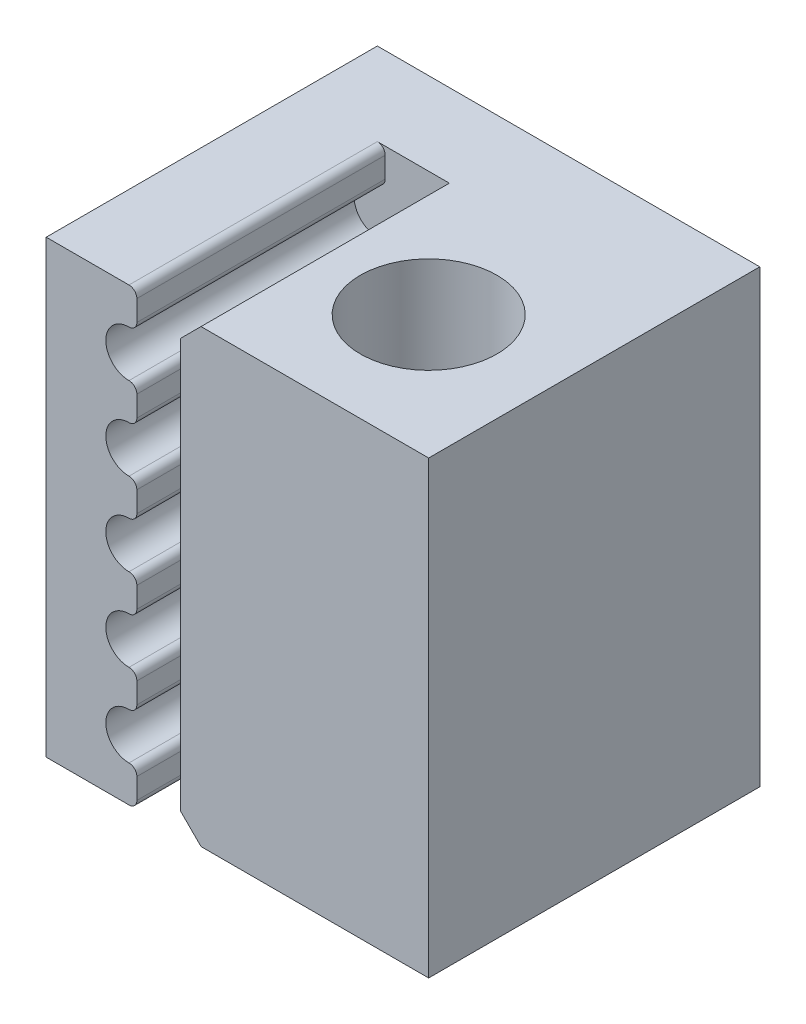
ISO-10303-21;
HEADER;
FILE_DESCRIPTION(('STEP AP214'),'2;1');
FILE_NAME('part.step','',(''),(''),'','','');
FILE_SCHEMA(('AUTOMOTIVE_DESIGN { 1 0 10303 214 1 1 1 1 }'));
ENDSEC;
DATA;
#1=APPLICATION_CONTEXT('core data for automotive mechanical design processes');
#2=APPLICATION_PROTOCOL_DEFINITION('international standard','automotive_design',2000,#1);
#3=PRODUCT_CONTEXT('',#1,'mechanical');
#4=PRODUCT('Part','Part','',(#3));
#5=PRODUCT_RELATED_PRODUCT_CATEGORY('part','',(#4));
#6=PRODUCT_DEFINITION_FORMATION('','',#4);
#7=PRODUCT_DEFINITION_CONTEXT('part definition',#1,'design');
#8=PRODUCT_DEFINITION('design','',#6,#7);
#9=PRODUCT_DEFINITION_SHAPE('','',#8);
#10=(LENGTH_UNIT() NAMED_UNIT(*) SI_UNIT(.MILLI.,.METRE.));
#11=(NAMED_UNIT(*) PLANE_ANGLE_UNIT() SI_UNIT($,.RADIAN.));
#12=(NAMED_UNIT(*) SI_UNIT($,.STERADIAN.) SOLID_ANGLE_UNIT());
#13=UNCERTAINTY_MEASURE_WITH_UNIT(LENGTH_MEASURE(1.E-05),#10,'distance_accuracy_value','');
#14=(GEOMETRIC_REPRESENTATION_CONTEXT(3) GLOBAL_UNCERTAINTY_ASSIGNED_CONTEXT((#13)) GLOBAL_UNIT_ASSIGNED_CONTEXT((#10,
#11,#12)) REPRESENTATION_CONTEXT('',''));
#15=CARTESIAN_POINT('',(0.,0.,0.));
#16=DIRECTION('',(0.,0.,1.));
#17=DIRECTION('',(1.,0.,0.));
#18=AXIS2_PLACEMENT_3D('',#15,#16,#17);
#19=CARTESIAN_POINT('',(0.,0.,0.));
#20=DIRECTION('',(0.,0.,-1.));
#21=DIRECTION('',(-1.,0.,0.));
#22=AXIS2_PLACEMENT_3D('',#19,#20,#21);
#23=PLANE('',#22);
#24=DIRECTION('',(0.,-1.,0.));
#25=VECTOR('',#24,1.);
#26=CARTESIAN_POINT('',(-6.,-5.80412192862059,0.));
#27=LINE('',#26,#25);
#28=CARTESIAN_POINT('',(-6.,10.38,0.));
#29=VERTEX_POINT('',#28);
#30=CARTESIAN_POINT('',(-6.,0.500000000000006,0.));
#31=VERTEX_POINT('',#30);
#32=EDGE_CURVE('E272',#29,#31,#27,.T.);
#33=ORIENTED_EDGE('',*,*,#32,.F.);
#34=DIRECTION('',(-0.707106781186549,-0.707106781186546,0.));
#35=VECTOR('',#34,1.);
#36=CARTESIAN_POINT('',(-8.18999999999999,8.19000000000002,0.));
#37=LINE('',#36,#35);
#38=CARTESIAN_POINT('',(-5.5,10.88,0.));
#39=VERTEX_POINT('',#38);
#40=EDGE_CURVE('E11',#29,#39,#37,.F.);
#41=ORIENTED_EDGE('',*,*,#40,.T.);
#42=DIRECTION('',(1.,0.,0.));
#43=VECTOR('',#42,1.);
#44=CARTESIAN_POINT('',(0.,10.88,0.));
#45=LINE('',#44,#43);
#46=CARTESIAN_POINT('',(-7.24,10.88,0.));
#47=VERTEX_POINT('',#46);
#48=EDGE_CURVE('E47',#47,#39,#45,.T.);
#49=ORIENTED_EDGE('',*,*,#48,.F.);
#50=CARTESIAN_POINT('',(-7.24,10.69,0.));
#51=DIRECTION('',(0.,0.,1.));
#52=DIRECTION('',(1.,0.,0.));
#53=AXIS2_PLACEMENT_3D('',#50,#51,#52);
#54=CIRCLE('',#53,0.190000000000002);
#55=CARTESIAN_POINT('',(-7.05,10.69,0.));
#56=VERTEX_POINT('',#55);
#57=EDGE_CURVE('E291',#47,#56,#54,.F.);
#58=ORIENTED_EDGE('',*,*,#57,.T.);
#59=DIRECTION('',(0.,1.,0.));
#60=VECTOR('',#59,1.);
#61=CARTESIAN_POINT('',(-7.05,-5.80412192862059,0.));
#62=LINE('',#61,#60);
#63=CARTESIAN_POINT('',(-7.05,10.19,0.));
#64=VERTEX_POINT('',#63);
#65=EDGE_CURVE('E473',#64,#56,#62,.T.);
#66=ORIENTED_EDGE('',*,*,#65,.F.);
#67=CARTESIAN_POINT('',(-7.24,10.19,0.));
#68=DIRECTION('',(0.,0.,1.));
#69=DIRECTION('',(1.,0.,0.));
#70=AXIS2_PLACEMENT_3D('',#67,#68,#69);
#71=CIRCLE('',#70,0.190000000000001);
#72=CARTESIAN_POINT('',(-7.24,10.,0.));
#73=VERTEX_POINT('',#72);
#74=EDGE_CURVE('E471',#64,#73,#71,.F.);
#75=ORIENTED_EDGE('',*,*,#74,.T.);
#76=CARTESIAN_POINT('',(-7.24,9.44,0.));
#77=DIRECTION('',(0.,0.,1.));
#78=DIRECTION('',(1.,0.,0.));
#79=AXIS2_PLACEMENT_3D('',#76,#77,#78);
#80=CIRCLE('',#79,0.56);
#81=CARTESIAN_POINT('',(-7.24,8.88,0.));
#82=VERTEX_POINT('',#81);
#83=EDGE_CURVE('E469',#73,#82,#80,.T.);
#84=ORIENTED_EDGE('',*,*,#83,.T.);
#85=CARTESIAN_POINT('',(-7.24,8.69,0.));
#86=DIRECTION('',(0.,0.,1.));
#87=DIRECTION('',(1.,0.,0.));
#88=AXIS2_PLACEMENT_3D('',#85,#86,#87);
#89=CIRCLE('',#88,0.190000000000001);
#90=CARTESIAN_POINT('',(-7.05,8.69,0.));
#91=VERTEX_POINT('',#90);
#92=EDGE_CURVE('E466',#91,#82,#89,.T.);
#93=ORIENTED_EDGE('',*,*,#92,.F.);
#94=DIRECTION('',(0.,-1.,0.));
#95=VECTOR('',#94,1.);
#96=CARTESIAN_POINT('',(-7.05,-5.80412192862059,0.));
#97=LINE('',#96,#95);
#98=CARTESIAN_POINT('',(-7.05,8.19,0.));
#99=VERTEX_POINT('',#98);
#100=EDGE_CURVE('E464',#91,#99,#97,.T.);
#101=ORIENTED_EDGE('',*,*,#100,.T.);
#102=CARTESIAN_POINT('',(-7.24,8.19,0.));
#103=DIRECTION('',(0.,0.,1.));
#104=DIRECTION('',(1.,0.,0.));
#105=AXIS2_PLACEMENT_3D('',#102,#103,#104);
#106=CIRCLE('',#105,0.189999999999999);
#107=CARTESIAN_POINT('',(-7.24,8.,0.));
#108=VERTEX_POINT('',#107);
#109=EDGE_CURVE('E461',#108,#99,#106,.T.);
#110=ORIENTED_EDGE('',*,*,#109,.F.);
#111=CARTESIAN_POINT('',(-7.24,7.44,0.));
#112=DIRECTION('',(0.,0.,1.));
#113=DIRECTION('',(1.,0.,0.));
#114=AXIS2_PLACEMENT_3D('',#111,#112,#113);
#115=CIRCLE('',#114,0.56);
#116=CARTESIAN_POINT('',(-7.24,6.88,0.));
#117=VERTEX_POINT('',#116);
#118=EDGE_CURVE('E459',#108,#117,#115,.T.);
#119=ORIENTED_EDGE('',*,*,#118,.T.);
#120=CARTESIAN_POINT('',(-7.24,6.69,0.));
#121=DIRECTION('',(0.,0.,1.));
#122=DIRECTION('',(1.,0.,0.));
#123=AXIS2_PLACEMENT_3D('',#120,#121,#122);
#124=CIRCLE('',#123,0.190000000000001);
#125=CARTESIAN_POINT('',(-7.05,6.69,0.));
#126=VERTEX_POINT('',#125);
#127=EDGE_CURVE('E456',#126,#117,#124,.T.);
#128=ORIENTED_EDGE('',*,*,#127,.F.);
#129=DIRECTION('',(0.,-1.,0.));
#130=VECTOR('',#129,1.);
#131=CARTESIAN_POINT('',(-7.05,-5.80412192862059,0.));
#132=LINE('',#131,#130);
#133=CARTESIAN_POINT('',(-7.05,6.19,0.));
#134=VERTEX_POINT('',#133);
#135=EDGE_CURVE('E454',#126,#134,#132,.T.);
#136=ORIENTED_EDGE('',*,*,#135,.T.);
#137=CARTESIAN_POINT('',(-7.24,6.19,0.));
#138=DIRECTION('',(0.,0.,1.));
#139=DIRECTION('',(1.,0.,0.));
#140=AXIS2_PLACEMENT_3D('',#137,#138,#139);
#141=CIRCLE('',#140,0.189999999999999);
#142=CARTESIAN_POINT('',(-7.24,6.,0.));
#143=VERTEX_POINT('',#142);
#144=EDGE_CURVE('E451',#143,#134,#141,.T.);
#145=ORIENTED_EDGE('',*,*,#144,.F.);
#146=CARTESIAN_POINT('',(-7.24,5.44,0.));
#147=DIRECTION('',(0.,0.,1.));
#148=DIRECTION('',(1.,0.,0.));
#149=AXIS2_PLACEMENT_3D('',#146,#147,#148);
#150=CIRCLE('',#149,0.559999999999998);
#151=CARTESIAN_POINT('',(-7.24,4.88000000000001,0.));
#152=VERTEX_POINT('',#151);
#153=EDGE_CURVE('E449',#143,#152,#150,.T.);
#154=ORIENTED_EDGE('',*,*,#153,.T.);
#155=CARTESIAN_POINT('',(-7.24,4.69,0.));
#156=DIRECTION('',(0.,0.,1.));
#157=DIRECTION('',(1.,0.,0.));
#158=AXIS2_PLACEMENT_3D('',#155,#156,#157);
#159=CIRCLE('',#158,0.190000000000001);
#160=CARTESIAN_POINT('',(-7.05,4.69,0.));
#161=VERTEX_POINT('',#160);
#162=EDGE_CURVE('E446',#161,#152,#159,.T.);
#163=ORIENTED_EDGE('',*,*,#162,.F.);
#164=DIRECTION('',(0.,-1.,0.));
#165=VECTOR('',#164,1.);
#166=CARTESIAN_POINT('',(-7.05,-5.80412192862059,0.));
#167=LINE('',#166,#165);
#168=CARTESIAN_POINT('',(-7.05,4.19,0.));
#169=VERTEX_POINT('',#168);
#170=EDGE_CURVE('E444',#161,#169,#167,.T.);
#171=ORIENTED_EDGE('',*,*,#170,.T.);
#172=CARTESIAN_POINT('',(-7.24,4.19,0.));
#173=DIRECTION('',(0.,0.,1.));
#174=DIRECTION('',(1.,0.,0.));
#175=AXIS2_PLACEMENT_3D('',#172,#173,#174);
#176=CIRCLE('',#175,0.189999999999999);
#177=CARTESIAN_POINT('',(-7.24,4.,0.));
#178=VERTEX_POINT('',#177);
#179=EDGE_CURVE('E441',#178,#169,#176,.T.);
#180=ORIENTED_EDGE('',*,*,#179,.F.);
#181=CARTESIAN_POINT('',(-7.24,3.44000000000001,0.));
#182=DIRECTION('',(0.,0.,1.));
#183=DIRECTION('',(1.,0.,0.));
#184=AXIS2_PLACEMENT_3D('',#181,#182,#183);
#185=CIRCLE('',#184,0.559999999999997);
#186=CARTESIAN_POINT('',(-7.24,2.88000000000001,0.));
#187=VERTEX_POINT('',#186);
#188=EDGE_CURVE('E439',#178,#187,#185,.T.);
#189=ORIENTED_EDGE('',*,*,#188,.T.);
#190=CARTESIAN_POINT('',(-7.24,2.69,0.));
#191=DIRECTION('',(0.,0.,1.));
#192=DIRECTION('',(1.,0.,0.));
#193=AXIS2_PLACEMENT_3D('',#190,#191,#192);
#194=CIRCLE('',#193,0.190000000000001);
#195=CARTESIAN_POINT('',(-7.05,2.69,0.));
#196=VERTEX_POINT('',#195);
#197=EDGE_CURVE('E436',#196,#187,#194,.T.);
#198=ORIENTED_EDGE('',*,*,#197,.F.);
#199=DIRECTION('',(0.,-1.,0.));
#200=VECTOR('',#199,1.);
#201=CARTESIAN_POINT('',(-7.05,-5.80412192862059,0.));
#202=LINE('',#201,#200);
#203=CARTESIAN_POINT('',(-7.05,2.19000000000001,0.));
#204=VERTEX_POINT('',#203);
#205=EDGE_CURVE('E434',#196,#204,#202,.T.);
#206=ORIENTED_EDGE('',*,*,#205,.T.);
#207=CARTESIAN_POINT('',(-7.24,2.19,0.));
#208=DIRECTION('',(0.,0.,1.));
#209=DIRECTION('',(1.,0.,0.));
#210=AXIS2_PLACEMENT_3D('',#207,#208,#209);
#211=CIRCLE('',#210,0.19);
#212=CARTESIAN_POINT('',(-7.24,2.,0.));
#213=VERTEX_POINT('',#212);
#214=EDGE_CURVE('E431',#213,#204,#211,.T.);
#215=ORIENTED_EDGE('',*,*,#214,.F.);
#216=CARTESIAN_POINT('',(-7.24,1.44000000000001,0.));
#217=DIRECTION('',(0.,0.,1.));
#218=DIRECTION('',(1.,0.,0.));
#219=AXIS2_PLACEMENT_3D('',#216,#217,#218);
#220=CIRCLE('',#219,0.559999999999996);
#221=CARTESIAN_POINT('',(-7.24,0.880000000000011,0.));
#222=VERTEX_POINT('',#221);
#223=EDGE_CURVE('E425',#213,#222,#220,.T.);
#224=ORIENTED_EDGE('',*,*,#223,.T.);
#225=CARTESIAN_POINT('',(-7.24,0.690000000000005,0.));
#226=DIRECTION('',(0.,0.,1.));
#227=DIRECTION('',(1.,0.,0.));
#228=AXIS2_PLACEMENT_3D('',#225,#226,#227);
#229=CIRCLE('',#228,0.190000000000001);
#230=CARTESIAN_POINT('',(-7.05,0.690000000000005,0.));
#231=VERTEX_POINT('',#230);
#232=EDGE_CURVE('E418',#231,#222,#229,.T.);
#233=ORIENTED_EDGE('',*,*,#232,.F.);
#234=DIRECTION('',(0.,-1.,0.));
#235=VECTOR('',#234,1.);
#236=CARTESIAN_POINT('',(-7.05,-5.80412192862059,0.));
#237=LINE('',#236,#235);
#238=CARTESIAN_POINT('',(-7.05,0.190000000000008,0.));
#239=VERTEX_POINT('',#238);
#240=EDGE_CURVE('E321',#231,#239,#237,.T.);
#241=ORIENTED_EDGE('',*,*,#240,.T.);
#242=CARTESIAN_POINT('',(-7.24,0.19,0.));
#243=DIRECTION('',(0.,0.,1.));
#244=DIRECTION('',(1.,0.,0.));
#245=AXIS2_PLACEMENT_3D('',#242,#243,#244);
#246=CIRCLE('',#245,0.19);
#247=CARTESIAN_POINT('',(-7.24,0.,0.));
#248=VERTEX_POINT('',#247);
#249=EDGE_CURVE('E261',#248,#239,#246,.T.);
#250=ORIENTED_EDGE('',*,*,#249,.F.);
#251=DIRECTION('',(-1.,0.,0.));
#252=VECTOR('',#251,1.);
#253=CARTESIAN_POINT('',(0.,0.,0.));
#254=LINE('',#253,#252);
#255=CARTESIAN_POINT('',(-5.49999999999999,0.,0.));
#256=VERTEX_POINT('',#255);
#257=EDGE_CURVE('E268',#256,#248,#254,.T.);
#258=ORIENTED_EDGE('',*,*,#257,.F.);
#259=DIRECTION('',(-0.707106781186546,0.707106781186549,0.));
#260=VECTOR('',#259,1.);
#261=CARTESIAN_POINT('',(-2.75000000000001,-2.75,0.));
#262=LINE('',#261,#260);
#263=EDGE_CURVE('E40',#256,#31,#262,.T.);
#264=ORIENTED_EDGE('',*,*,#263,.T.);
#265=EDGE_LOOP('',(#33,#41,#49,#58,#66,#75,#84,#93,#101,#110,#119,#128,#136,#145,#154,#163,#171,
#180,#189,#198,#206,#215,#224,#233,#241,#250,#258,#264));
#266=FACE_BOUND('',#265,.T.);
#267=ADVANCED_FACE('F32',(#266),#23,.F.);
#268=CARTESIAN_POINT('',(-4.62,0.,6.));
#269=DIRECTION('',(0.,-1.,0.));
#270=DIRECTION('',(1.,0.,0.));
#271=AXIS2_PLACEMENT_3D('',#268,#269,#270);
#272=PLANE('',#271);
#273=CARTESIAN_POINT('',(-3.00000000000001,0.,3.));
#274=DIRECTION('',(0.,-1.,0.));
#275=DIRECTION('',(1.,0.,0.));
#276=AXIS2_PLACEMENT_3D('',#273,#274,#275);
#277=CIRCLE('',#276,1.65);
#278=CARTESIAN_POINT('',(-1.35000000000001,0.,3.));
#279=VERTEX_POINT('',#278);
#280=EDGE_CURVE('E275',#279,#279,#277,.F.);
#281=ORIENTED_EDGE('',*,*,#280,.T.);
#282=EDGE_LOOP('',(#281));
#283=FACE_BOUND('',#282,.T.);
#284=DIRECTION('',(1.,0.,0.));
#285=VECTOR('',#284,1.);
#286=CARTESIAN_POINT('',(-4.62,0.,6.));
#287=LINE('',#286,#285);
#288=CARTESIAN_POINT('',(-5.5,0.,6.));
#289=VERTEX_POINT('',#288);
#290=CARTESIAN_POINT('',(0.,0.,6.));
#291=VERTEX_POINT('',#290);
#292=EDGE_CURVE('E240',#289,#291,#287,.T.);
#293=ORIENTED_EDGE('',*,*,#292,.F.);
#294=DIRECTION('',(0.,0.,-1.));
#295=VECTOR('',#294,1.);
#296=CARTESIAN_POINT('',(-5.49999999999999,0.,0.));
#297=LINE('',#296,#295);
#298=EDGE_CURVE('E294',#289,#256,#297,.T.);
#299=ORIENTED_EDGE('',*,*,#298,.T.);
#300=ORIENTED_EDGE('',*,*,#257,.T.);
#301=DIRECTION('',(0.,0.,-1.));
#302=VECTOR('',#301,1.);
#303=CARTESIAN_POINT('',(-7.24,0.,6.));
#304=LINE('',#303,#302);
#305=CARTESIAN_POINT('',(-7.24,0.,6.));
#306=VERTEX_POINT('',#305);
#307=EDGE_CURVE('E297',#306,#248,#304,.T.);
#308=ORIENTED_EDGE('',*,*,#307,.F.);
#309=DIRECTION('',(-1.,0.,0.));
#310=VECTOR('',#309,1.);
#311=CARTESIAN_POINT('',(-4.62,0.,6.));
#312=LINE('',#311,#310);
#313=CARTESIAN_POINT('',(-9.24,0.,6.));
#314=VERTEX_POINT('',#313);
#315=EDGE_CURVE('E478',#306,#314,#312,.T.);
#316=ORIENTED_EDGE('',*,*,#315,.T.);
#317=DIRECTION('',(0.,0.,-1.));
#318=VECTOR('',#317,1.);
#319=CARTESIAN_POINT('',(-9.24,0.,6.));
#320=LINE('',#319,#318);
#321=CARTESIAN_POINT('',(-9.24,0.,-2.));
#322=VERTEX_POINT('',#321);
#323=EDGE_CURVE('E347',#314,#322,#320,.T.);
#324=ORIENTED_EDGE('',*,*,#323,.T.);
#325=DIRECTION('',(-1.,0.,0.));
#326=VECTOR('',#325,1.);
#327=CARTESIAN_POINT('',(0.,0.,-2.));
#328=LINE('',#327,#326);
#329=CARTESIAN_POINT('',(0.,0.,-2.));
#330=VERTEX_POINT('',#329);
#331=EDGE_CURVE('E257',#330,#322,#328,.T.);
#332=ORIENTED_EDGE('',*,*,#331,.F.);
#333=DIRECTION('',(0.,0.,1.));
#334=VECTOR('',#333,1.);
#335=CARTESIAN_POINT('',(0.,0.,-2.));
#336=LINE('',#335,#334);
#337=EDGE_CURVE('E254',#330,#291,#336,.T.);
#338=ORIENTED_EDGE('',*,*,#337,.T.);
#339=EDGE_LOOP('',(#293,#299,#300,#308,#316,#324,#332,#338));
#340=FACE_BOUND('',#339,.T.);
#341=ADVANCED_FACE('F255',(#283,#340),#272,.T.);
#342=CARTESIAN_POINT('',(-7.24,0.19,6.));
#343=DIRECTION('',(0.,0.,-1.));
#344=DIRECTION('',(-1.,0.,0.));
#345=AXIS2_PLACEMENT_3D('',#342,#343,#344);
#346=CYLINDRICAL_SURFACE('',#345,0.19);
#347=ORIENTED_EDGE('',*,*,#249,.T.);
#348=DIRECTION('',(0.,0.,-1.));
#349=VECTOR('',#348,1.);
#350=CARTESIAN_POINT('',(-7.05,0.190000000000008,6.));
#351=LINE('',#350,#349);
#352=CARTESIAN_POINT('',(-7.05,0.190000000000008,6.));
#353=VERTEX_POINT('',#352);
#354=EDGE_CURVE('E329',#353,#239,#351,.T.);
#355=ORIENTED_EDGE('',*,*,#354,.F.);
#356=CARTESIAN_POINT('',(-7.24,0.19,6.));
#357=DIRECTION('',(0.,0.,1.));
#358=DIRECTION('',(1.,0.,0.));
#359=AXIS2_PLACEMENT_3D('',#356,#357,#358);
#360=CIRCLE('',#359,0.19);
#361=EDGE_CURVE('E327',#306,#353,#360,.T.);
#362=ORIENTED_EDGE('',*,*,#361,.F.);
#363=ORIENTED_EDGE('',*,*,#307,.T.);
#364=EDGE_LOOP('',(#347,#355,#362,#363));
#365=FACE_BOUND('',#364,.T.);
#366=ADVANCED_FACE('F326',(#365),#346,.T.);
#367=CARTESIAN_POINT('',(-7.05,-5.80412192862059,6.));
#368=DIRECTION('',(1.,0.,0.));
#369=DIRECTION('',(0.,0.,-1.));
#370=AXIS2_PLACEMENT_3D('',#367,#368,#369);
#371=PLANE('',#370);
#372=ORIENTED_EDGE('',*,*,#240,.F.);
#373=DIRECTION('',(0.,0.,-1.));
#374=VECTOR('',#373,1.);
#375=CARTESIAN_POINT('',(-7.05,0.690000000000005,6.));
#376=LINE('',#375,#374);
#377=CARTESIAN_POINT('',(-7.05,0.690000000000005,6.));
#378=VERTEX_POINT('',#377);
#379=EDGE_CURVE('E331',#378,#231,#376,.T.);
#380=ORIENTED_EDGE('',*,*,#379,.F.);
#381=DIRECTION('',(0.,-1.,0.));
#382=VECTOR('',#381,1.);
#383=CARTESIAN_POINT('',(-7.05,-5.80412192862059,6.));
#384=LINE('',#383,#382);
#385=EDGE_CURVE('E480',#378,#353,#384,.T.);
#386=ORIENTED_EDGE('',*,*,#385,.T.);
#387=ORIENTED_EDGE('',*,*,#354,.T.);
#388=EDGE_LOOP('',(#372,#380,#386,#387));
#389=FACE_BOUND('',#388,.T.);
#390=ADVANCED_FACE('F423',(#389),#371,.T.);
#391=CARTESIAN_POINT('',(-7.24,0.690000000000005,6.));
#392=DIRECTION('',(0.,0.,-1.));
#393=DIRECTION('',(-1.,0.,0.));
#394=AXIS2_PLACEMENT_3D('',#391,#392,#393);
#395=CYLINDRICAL_SURFACE('',#394,0.190000000000001);
#396=ORIENTED_EDGE('',*,*,#232,.T.);
#397=DIRECTION('',(0.,0.,-1.));
#398=VECTOR('',#397,1.);
#399=CARTESIAN_POINT('',(-7.24,0.880000000000011,6.));
#400=LINE('',#399,#398);
#401=CARTESIAN_POINT('',(-7.24,0.880000000000011,6.));
#402=VERTEX_POINT('',#401);
#403=EDGE_CURVE('E409',#402,#222,#400,.T.);
#404=ORIENTED_EDGE('',*,*,#403,.F.);
#405=CARTESIAN_POINT('',(-7.24,0.690000000000005,6.));
#406=DIRECTION('',(0.,0.,1.));
#407=DIRECTION('',(1.,0.,0.));
#408=AXIS2_PLACEMENT_3D('',#405,#406,#407);
#409=CIRCLE('',#408,0.190000000000001);
#410=EDGE_CURVE('E419',#378,#402,#409,.T.);
#411=ORIENTED_EDGE('',*,*,#410,.F.);
#412=ORIENTED_EDGE('',*,*,#379,.T.);
#413=EDGE_LOOP('',(#396,#404,#411,#412));
#414=FACE_BOUND('',#413,.T.);
#415=ADVANCED_FACE('F416',(#414),#395,.T.);
#416=CARTESIAN_POINT('',(-7.24,1.44000000000001,6.));
#417=DIRECTION('',(0.,0.,-1.));
#418=DIRECTION('',(-1.,0.,0.));
#419=AXIS2_PLACEMENT_3D('',#416,#417,#418);
#420=CYLINDRICAL_SURFACE('',#419,0.559999999999996);
#421=ORIENTED_EDGE('',*,*,#223,.F.);
#422=DIRECTION('',(0.,0.,-1.));
#423=VECTOR('',#422,1.);
#424=CARTESIAN_POINT('',(-7.24,2.,6.));
#425=LINE('',#424,#423);
#426=CARTESIAN_POINT('',(-7.24,2.,6.));
#427=VERTEX_POINT('',#426);
#428=EDGE_CURVE('E406',#427,#213,#425,.T.);
#429=ORIENTED_EDGE('',*,*,#428,.F.);
#430=CARTESIAN_POINT('',(-7.24,1.44000000000001,6.));
#431=DIRECTION('',(0.,0.,1.));
#432=DIRECTION('',(1.,0.,0.));
#433=AXIS2_PLACEMENT_3D('',#430,#431,#432);
#434=CIRCLE('',#433,0.559999999999996);
#435=EDGE_CURVE('E486',#427,#402,#434,.T.);
#436=ORIENTED_EDGE('',*,*,#435,.T.);
#437=ORIENTED_EDGE('',*,*,#403,.T.);
#438=EDGE_LOOP('',(#421,#429,#436,#437));
#439=FACE_BOUND('',#438,.T.);
#440=ADVANCED_FACE('F646',(#439),#420,.F.);
#441=CARTESIAN_POINT('',(-7.24,2.19,6.));
#442=DIRECTION('',(0.,0.,-1.));
#443=DIRECTION('',(-1.,0.,0.));
#444=AXIS2_PLACEMENT_3D('',#441,#442,#443);
#445=CYLINDRICAL_SURFACE('',#444,0.19);
#446=ORIENTED_EDGE('',*,*,#214,.T.);
#447=DIRECTION('',(0.,0.,-1.));
#448=VECTOR('',#447,1.);
#449=CARTESIAN_POINT('',(-7.05,2.19000000000001,6.));
#450=LINE('',#449,#448);
#451=CARTESIAN_POINT('',(-7.05,2.19000000000001,6.));
#452=VERTEX_POINT('',#451);
#453=EDGE_CURVE('E403',#452,#204,#450,.T.);
#454=ORIENTED_EDGE('',*,*,#453,.F.);
#455=CARTESIAN_POINT('',(-7.24,2.19,6.));
#456=DIRECTION('',(0.,0.,1.));
#457=DIRECTION('',(1.,0.,0.));
#458=AXIS2_PLACEMENT_3D('',#455,#456,#457);
#459=CIRCLE('',#458,0.19);
#460=EDGE_CURVE('E489',#427,#452,#459,.T.);
#461=ORIENTED_EDGE('',*,*,#460,.F.);
#462=ORIENTED_EDGE('',*,*,#428,.T.);
#463=EDGE_LOOP('',(#446,#454,#461,#462));
#464=FACE_BOUND('',#463,.T.);
#465=ADVANCED_FACE('F642',(#464),#445,.T.);
#466=CARTESIAN_POINT('',(-7.05,-5.80412192862059,6.));
#467=DIRECTION('',(1.,0.,0.));
#468=DIRECTION('',(0.,0.,-1.));
#469=AXIS2_PLACEMENT_3D('',#466,#467,#468);
#470=PLANE('',#469);
#471=ORIENTED_EDGE('',*,*,#205,.F.);
#472=DIRECTION('',(0.,0.,-1.));
#473=VECTOR('',#472,1.);
#474=CARTESIAN_POINT('',(-7.05,2.69,6.));
#475=LINE('',#474,#473);
#476=CARTESIAN_POINT('',(-7.05,2.69,6.));
#477=VERTEX_POINT('',#476);
#478=EDGE_CURVE('E400',#477,#196,#475,.T.);
#479=ORIENTED_EDGE('',*,*,#478,.F.);
#480=DIRECTION('',(0.,-1.,0.));
#481=VECTOR('',#480,1.);
#482=CARTESIAN_POINT('',(-7.05,-5.80412192862059,6.));
#483=LINE('',#482,#481);
#484=EDGE_CURVE('E491',#477,#452,#483,.T.);
#485=ORIENTED_EDGE('',*,*,#484,.T.);
#486=ORIENTED_EDGE('',*,*,#453,.T.);
#487=EDGE_LOOP('',(#471,#479,#485,#486));
#488=FACE_BOUND('',#487,.T.);
#489=ADVANCED_FACE('F638',(#488),#470,.T.);
#490=CARTESIAN_POINT('',(-7.24,2.69,6.));
#491=DIRECTION('',(0.,0.,-1.));
#492=DIRECTION('',(-1.,0.,0.));
#493=AXIS2_PLACEMENT_3D('',#490,#491,#492);
#494=CYLINDRICAL_SURFACE('',#493,0.190000000000001);
#495=ORIENTED_EDGE('',*,*,#197,.T.);
#496=DIRECTION('',(0.,0.,-1.));
#497=VECTOR('',#496,1.);
#498=CARTESIAN_POINT('',(-7.24,2.88000000000001,6.));
#499=LINE('',#498,#497);
#500=CARTESIAN_POINT('',(-7.24,2.88000000000001,6.));
#501=VERTEX_POINT('',#500);
#502=EDGE_CURVE('E397',#501,#187,#499,.T.);
#503=ORIENTED_EDGE('',*,*,#502,.F.);
#504=CARTESIAN_POINT('',(-7.24,2.69,6.));
#505=DIRECTION('',(0.,0.,1.));
#506=DIRECTION('',(1.,0.,0.));
#507=AXIS2_PLACEMENT_3D('',#504,#505,#506);
#508=CIRCLE('',#507,0.190000000000001);
#509=EDGE_CURVE('E494',#477,#501,#508,.T.);
#510=ORIENTED_EDGE('',*,*,#509,.F.);
#511=ORIENTED_EDGE('',*,*,#478,.T.);
#512=EDGE_LOOP('',(#495,#503,#510,#511));
#513=FACE_BOUND('',#512,.T.);
#514=ADVANCED_FACE('F634',(#513),#494,.T.);
#515=CARTESIAN_POINT('',(-7.24,3.44000000000001,6.));
#516=DIRECTION('',(0.,0.,-1.));
#517=DIRECTION('',(-1.,0.,0.));
#518=AXIS2_PLACEMENT_3D('',#515,#516,#517);
#519=CYLINDRICAL_SURFACE('',#518,0.559999999999997);
#520=ORIENTED_EDGE('',*,*,#188,.F.);
#521=DIRECTION('',(0.,0.,-1.));
#522=VECTOR('',#521,1.);
#523=CARTESIAN_POINT('',(-7.24,4.,6.));
#524=LINE('',#523,#522);
#525=CARTESIAN_POINT('',(-7.24,4.,6.));
#526=VERTEX_POINT('',#525);
#527=EDGE_CURVE('E394',#526,#178,#524,.T.);
#528=ORIENTED_EDGE('',*,*,#527,.F.);
#529=CARTESIAN_POINT('',(-7.24,3.44000000000001,6.));
#530=DIRECTION('',(0.,0.,1.));
#531=DIRECTION('',(1.,0.,0.));
#532=AXIS2_PLACEMENT_3D('',#529,#530,#531);
#533=CIRCLE('',#532,0.559999999999997);
#534=EDGE_CURVE('E496',#526,#501,#533,.T.);
#535=ORIENTED_EDGE('',*,*,#534,.T.);
#536=ORIENTED_EDGE('',*,*,#502,.T.);
#537=EDGE_LOOP('',(#520,#528,#535,#536));
#538=FACE_BOUND('',#537,.T.);
#539=ADVANCED_FACE('F630',(#538),#519,.F.);
#540=CARTESIAN_POINT('',(-7.24,4.19,6.));
#541=DIRECTION('',(0.,0.,-1.));
#542=DIRECTION('',(-1.,0.,0.));
#543=AXIS2_PLACEMENT_3D('',#540,#541,#542);
#544=CYLINDRICAL_SURFACE('',#543,0.189999999999999);
#545=ORIENTED_EDGE('',*,*,#179,.T.);
#546=DIRECTION('',(0.,0.,-1.));
#547=VECTOR('',#546,1.);
#548=CARTESIAN_POINT('',(-7.05,4.19,6.));
#549=LINE('',#548,#547);
#550=CARTESIAN_POINT('',(-7.05,4.19,6.));
#551=VERTEX_POINT('',#550);
#552=EDGE_CURVE('E391',#551,#169,#549,.T.);
#553=ORIENTED_EDGE('',*,*,#552,.F.);
#554=CARTESIAN_POINT('',(-7.24,4.19,6.));
#555=DIRECTION('',(0.,0.,1.));
#556=DIRECTION('',(1.,0.,0.));
#557=AXIS2_PLACEMENT_3D('',#554,#555,#556);
#558=CIRCLE('',#557,0.189999999999999);
#559=EDGE_CURVE('E499',#526,#551,#558,.T.);
#560=ORIENTED_EDGE('',*,*,#559,.F.);
#561=ORIENTED_EDGE('',*,*,#527,.T.);
#562=EDGE_LOOP('',(#545,#553,#560,#561));
#563=FACE_BOUND('',#562,.T.);
#564=ADVANCED_FACE('F626',(#563),#544,.T.);
#565=CARTESIAN_POINT('',(-7.05,-5.80412192862059,6.));
#566=DIRECTION('',(1.,0.,0.));
#567=DIRECTION('',(0.,0.,-1.));
#568=AXIS2_PLACEMENT_3D('',#565,#566,#567);
#569=PLANE('',#568);
#570=ORIENTED_EDGE('',*,*,#170,.F.);
#571=DIRECTION('',(0.,0.,-1.));
#572=VECTOR('',#571,1.);
#573=CARTESIAN_POINT('',(-7.05,4.69,6.));
#574=LINE('',#573,#572);
#575=CARTESIAN_POINT('',(-7.05,4.69,6.));
#576=VERTEX_POINT('',#575);
#577=EDGE_CURVE('E388',#576,#161,#574,.T.);
#578=ORIENTED_EDGE('',*,*,#577,.F.);
#579=DIRECTION('',(0.,-1.,0.));
#580=VECTOR('',#579,1.);
#581=CARTESIAN_POINT('',(-7.05,-5.80412192862059,6.));
#582=LINE('',#581,#580);
#583=EDGE_CURVE('E501',#576,#551,#582,.T.);
#584=ORIENTED_EDGE('',*,*,#583,.T.);
#585=ORIENTED_EDGE('',*,*,#552,.T.);
#586=EDGE_LOOP('',(#570,#578,#584,#585));
#587=FACE_BOUND('',#586,.T.);
#588=ADVANCED_FACE('F622',(#587),#569,.T.);
#589=CARTESIAN_POINT('',(-7.24,4.69,6.));
#590=DIRECTION('',(0.,0.,-1.));
#591=DIRECTION('',(-1.,0.,0.));
#592=AXIS2_PLACEMENT_3D('',#589,#590,#591);
#593=CYLINDRICAL_SURFACE('',#592,0.190000000000001);
#594=ORIENTED_EDGE('',*,*,#162,.T.);
#595=DIRECTION('',(0.,0.,-1.));
#596=VECTOR('',#595,1.);
#597=CARTESIAN_POINT('',(-7.24,4.88000000000001,6.));
#598=LINE('',#597,#596);
#599=CARTESIAN_POINT('',(-7.24,4.88000000000001,6.));
#600=VERTEX_POINT('',#599);
#601=EDGE_CURVE('E385',#600,#152,#598,.T.);
#602=ORIENTED_EDGE('',*,*,#601,.F.);
#603=CARTESIAN_POINT('',(-7.24,4.69,6.));
#604=DIRECTION('',(0.,0.,1.));
#605=DIRECTION('',(1.,0.,0.));
#606=AXIS2_PLACEMENT_3D('',#603,#604,#605);
#607=CIRCLE('',#606,0.190000000000001);
#608=EDGE_CURVE('E504',#576,#600,#607,.T.);
#609=ORIENTED_EDGE('',*,*,#608,.F.);
#610=ORIENTED_EDGE('',*,*,#577,.T.);
#611=EDGE_LOOP('',(#594,#602,#609,#610));
#612=FACE_BOUND('',#611,.T.);
#613=ADVANCED_FACE('F618',(#612),#593,.T.);
#614=CARTESIAN_POINT('',(-7.24,5.44,6.));
#615=DIRECTION('',(0.,0.,-1.));
#616=DIRECTION('',(-1.,0.,0.));
#617=AXIS2_PLACEMENT_3D('',#614,#615,#616);
#618=CYLINDRICAL_SURFACE('',#617,0.559999999999998);
#619=ORIENTED_EDGE('',*,*,#153,.F.);
#620=DIRECTION('',(0.,0.,-1.));
#621=VECTOR('',#620,1.);
#622=CARTESIAN_POINT('',(-7.24,6.,6.));
#623=LINE('',#622,#621);
#624=CARTESIAN_POINT('',(-7.24,6.,6.));
#625=VERTEX_POINT('',#624);
#626=EDGE_CURVE('E382',#625,#143,#623,.T.);
#627=ORIENTED_EDGE('',*,*,#626,.F.);
#628=CARTESIAN_POINT('',(-7.24,5.44,6.));
#629=DIRECTION('',(0.,0.,1.));
#630=DIRECTION('',(1.,0.,0.));
#631=AXIS2_PLACEMENT_3D('',#628,#629,#630);
#632=CIRCLE('',#631,0.559999999999998);
#633=EDGE_CURVE('E506',#625,#600,#632,.T.);
#634=ORIENTED_EDGE('',*,*,#633,.T.);
#635=ORIENTED_EDGE('',*,*,#601,.T.);
#636=EDGE_LOOP('',(#619,#627,#634,#635));
#637=FACE_BOUND('',#636,.T.);
#638=ADVANCED_FACE('F614',(#637),#618,.F.);
#639=CARTESIAN_POINT('',(-7.24,6.19,6.));
#640=DIRECTION('',(0.,0.,-1.));
#641=DIRECTION('',(-1.,0.,0.));
#642=AXIS2_PLACEMENT_3D('',#639,#640,#641);
#643=CYLINDRICAL_SURFACE('',#642,0.189999999999999);
#644=ORIENTED_EDGE('',*,*,#144,.T.);
#645=DIRECTION('',(0.,0.,-1.));
#646=VECTOR('',#645,1.);
#647=CARTESIAN_POINT('',(-7.05,6.19,6.));
#648=LINE('',#647,#646);
#649=CARTESIAN_POINT('',(-7.05,6.19,6.));
#650=VERTEX_POINT('',#649);
#651=EDGE_CURVE('E379',#650,#134,#648,.T.);
#652=ORIENTED_EDGE('',*,*,#651,.F.);
#653=CARTESIAN_POINT('',(-7.24,6.19,6.));
#654=DIRECTION('',(0.,0.,1.));
#655=DIRECTION('',(1.,0.,0.));
#656=AXIS2_PLACEMENT_3D('',#653,#654,#655);
#657=CIRCLE('',#656,0.189999999999999);
#658=EDGE_CURVE('E509',#625,#650,#657,.T.);
#659=ORIENTED_EDGE('',*,*,#658,.F.);
#660=ORIENTED_EDGE('',*,*,#626,.T.);
#661=EDGE_LOOP('',(#644,#652,#659,#660));
#662=FACE_BOUND('',#661,.T.);
#663=ADVANCED_FACE('F610',(#662),#643,.T.);
#664=CARTESIAN_POINT('',(-7.05,-5.80412192862059,6.));
#665=DIRECTION('',(1.,0.,0.));
#666=DIRECTION('',(0.,0.,-1.));
#667=AXIS2_PLACEMENT_3D('',#664,#665,#666);
#668=PLANE('',#667);
#669=ORIENTED_EDGE('',*,*,#135,.F.);
#670=DIRECTION('',(0.,0.,-1.));
#671=VECTOR('',#670,1.);
#672=CARTESIAN_POINT('',(-7.05,6.69,6.));
#673=LINE('',#672,#671);
#674=CARTESIAN_POINT('',(-7.05,6.69,6.));
#675=VERTEX_POINT('',#674);
#676=EDGE_CURVE('E376',#675,#126,#673,.T.);
#677=ORIENTED_EDGE('',*,*,#676,.F.);
#678=DIRECTION('',(0.,-1.,0.));
#679=VECTOR('',#678,1.);
#680=CARTESIAN_POINT('',(-7.05,-5.80412192862059,6.));
#681=LINE('',#680,#679);
#682=EDGE_CURVE('E511',#675,#650,#681,.T.);
#683=ORIENTED_EDGE('',*,*,#682,.T.);
#684=ORIENTED_EDGE('',*,*,#651,.T.);
#685=EDGE_LOOP('',(#669,#677,#683,#684));
#686=FACE_BOUND('',#685,.T.);
#687=ADVANCED_FACE('F606',(#686),#668,.T.);
#688=CARTESIAN_POINT('',(-7.24,6.69,6.));
#689=DIRECTION('',(0.,0.,-1.));
#690=DIRECTION('',(-1.,0.,0.));
#691=AXIS2_PLACEMENT_3D('',#688,#689,#690);
#692=CYLINDRICAL_SURFACE('',#691,0.190000000000001);
#693=ORIENTED_EDGE('',*,*,#127,.T.);
#694=DIRECTION('',(0.,0.,-1.));
#695=VECTOR('',#694,1.);
#696=CARTESIAN_POINT('',(-7.24,6.88,6.));
#697=LINE('',#696,#695);
#698=CARTESIAN_POINT('',(-7.24,6.88,6.));
#699=VERTEX_POINT('',#698);
#700=EDGE_CURVE('E373',#699,#117,#697,.T.);
#701=ORIENTED_EDGE('',*,*,#700,.F.);
#702=CARTESIAN_POINT('',(-7.24,6.69,6.));
#703=DIRECTION('',(0.,0.,1.));
#704=DIRECTION('',(1.,0.,0.));
#705=AXIS2_PLACEMENT_3D('',#702,#703,#704);
#706=CIRCLE('',#705,0.190000000000001);
#707=EDGE_CURVE('E514',#675,#699,#706,.T.);
#708=ORIENTED_EDGE('',*,*,#707,.F.);
#709=ORIENTED_EDGE('',*,*,#676,.T.);
#710=EDGE_LOOP('',(#693,#701,#708,#709));
#711=FACE_BOUND('',#710,.T.);
#712=ADVANCED_FACE('F602',(#711),#692,.T.);
#713=CARTESIAN_POINT('',(-7.24,7.44,6.));
#714=DIRECTION('',(0.,0.,-1.));
#715=DIRECTION('',(-1.,0.,0.));
#716=AXIS2_PLACEMENT_3D('',#713,#714,#715);
#717=CYLINDRICAL_SURFACE('',#716,0.56);
#718=ORIENTED_EDGE('',*,*,#118,.F.);
#719=DIRECTION('',(0.,0.,-1.));
#720=VECTOR('',#719,1.);
#721=CARTESIAN_POINT('',(-7.24,8.,6.));
#722=LINE('',#721,#720);
#723=CARTESIAN_POINT('',(-7.24,8.,6.));
#724=VERTEX_POINT('',#723);
#725=EDGE_CURVE('E370',#724,#108,#722,.T.);
#726=ORIENTED_EDGE('',*,*,#725,.F.);
#727=CARTESIAN_POINT('',(-7.24,7.44,6.));
#728=DIRECTION('',(0.,0.,1.));
#729=DIRECTION('',(1.,0.,0.));
#730=AXIS2_PLACEMENT_3D('',#727,#728,#729);
#731=CIRCLE('',#730,0.56);
#732=EDGE_CURVE('E516',#724,#699,#731,.T.);
#733=ORIENTED_EDGE('',*,*,#732,.T.);
#734=ORIENTED_EDGE('',*,*,#700,.T.);
#735=EDGE_LOOP('',(#718,#726,#733,#734));
#736=FACE_BOUND('',#735,.T.);
#737=ADVANCED_FACE('F598',(#736),#717,.F.);
#738=CARTESIAN_POINT('',(-7.24,8.19,6.));
#739=DIRECTION('',(0.,0.,-1.));
#740=DIRECTION('',(-1.,0.,0.));
#741=AXIS2_PLACEMENT_3D('',#738,#739,#740);
#742=CYLINDRICAL_SURFACE('',#741,0.189999999999999);
#743=ORIENTED_EDGE('',*,*,#109,.T.);
#744=DIRECTION('',(0.,0.,-1.));
#745=VECTOR('',#744,1.);
#746=CARTESIAN_POINT('',(-7.05,8.19,6.));
#747=LINE('',#746,#745);
#748=CARTESIAN_POINT('',(-7.05,8.19,6.));
#749=VERTEX_POINT('',#748);
#750=EDGE_CURVE('E367',#749,#99,#747,.T.);
#751=ORIENTED_EDGE('',*,*,#750,.F.);
#752=CARTESIAN_POINT('',(-7.24,8.19,6.));
#753=DIRECTION('',(0.,0.,1.));
#754=DIRECTION('',(1.,0.,0.));
#755=AXIS2_PLACEMENT_3D('',#752,#753,#754);
#756=CIRCLE('',#755,0.189999999999999);
#757=EDGE_CURVE('E519',#724,#749,#756,.T.);
#758=ORIENTED_EDGE('',*,*,#757,.F.);
#759=ORIENTED_EDGE('',*,*,#725,.T.);
#760=EDGE_LOOP('',(#743,#751,#758,#759));
#761=FACE_BOUND('',#760,.T.);
#762=ADVANCED_FACE('F594',(#761),#742,.T.);
#763=CARTESIAN_POINT('',(-7.05,-5.80412192862059,6.));
#764=DIRECTION('',(1.,0.,0.));
#765=DIRECTION('',(0.,0.,-1.));
#766=AXIS2_PLACEMENT_3D('',#763,#764,#765);
#767=PLANE('',#766);
#768=ORIENTED_EDGE('',*,*,#100,.F.);
#769=DIRECTION('',(0.,0.,-1.));
#770=VECTOR('',#769,1.);
#771=CARTESIAN_POINT('',(-7.05,8.69,6.));
#772=LINE('',#771,#770);
#773=CARTESIAN_POINT('',(-7.05,8.69,6.));
#774=VERTEX_POINT('',#773);
#775=EDGE_CURVE('E364',#774,#91,#772,.T.);
#776=ORIENTED_EDGE('',*,*,#775,.F.);
#777=DIRECTION('',(0.,-1.,0.));
#778=VECTOR('',#777,1.);
#779=CARTESIAN_POINT('',(-7.05,-5.80412192862059,6.));
#780=LINE('',#779,#778);
#781=EDGE_CURVE('E521',#774,#749,#780,.T.);
#782=ORIENTED_EDGE('',*,*,#781,.T.);
#783=ORIENTED_EDGE('',*,*,#750,.T.);
#784=EDGE_LOOP('',(#768,#776,#782,#783));
#785=FACE_BOUND('',#784,.T.);
#786=ADVANCED_FACE('F590',(#785),#767,.T.);
#787=CARTESIAN_POINT('',(-7.24,8.69,6.));
#788=DIRECTION('',(0.,0.,-1.));
#789=DIRECTION('',(-1.,0.,0.));
#790=AXIS2_PLACEMENT_3D('',#787,#788,#789);
#791=CYLINDRICAL_SURFACE('',#790,0.190000000000001);
#792=ORIENTED_EDGE('',*,*,#92,.T.);
#793=DIRECTION('',(0.,0.,-1.));
#794=VECTOR('',#793,1.);
#795=CARTESIAN_POINT('',(-7.24,8.88,6.));
#796=LINE('',#795,#794);
#797=CARTESIAN_POINT('',(-7.24,8.88,6.));
#798=VERTEX_POINT('',#797);
#799=EDGE_CURVE('E361',#798,#82,#796,.T.);
#800=ORIENTED_EDGE('',*,*,#799,.F.);
#801=CARTESIAN_POINT('',(-7.24,8.69,6.));
#802=DIRECTION('',(0.,0.,1.));
#803=DIRECTION('',(1.,0.,0.));
#804=AXIS2_PLACEMENT_3D('',#801,#802,#803);
#805=CIRCLE('',#804,0.190000000000001);
#806=EDGE_CURVE('E524',#774,#798,#805,.T.);
#807=ORIENTED_EDGE('',*,*,#806,.F.);
#808=ORIENTED_EDGE('',*,*,#775,.T.);
#809=EDGE_LOOP('',(#792,#800,#807,#808));
#810=FACE_BOUND('',#809,.T.);
#811=ADVANCED_FACE('F586',(#810),#791,.T.);
#812=CARTESIAN_POINT('',(-7.24,9.44,6.));
#813=DIRECTION('',(0.,0.,-1.));
#814=DIRECTION('',(-1.,0.,0.));
#815=AXIS2_PLACEMENT_3D('',#812,#813,#814);
#816=CYLINDRICAL_SURFACE('',#815,0.56);
#817=ORIENTED_EDGE('',*,*,#83,.F.);
#818=DIRECTION('',(0.,0.,-1.));
#819=VECTOR('',#818,1.);
#820=CARTESIAN_POINT('',(-7.24,10.,6.));
#821=LINE('',#820,#819);
#822=CARTESIAN_POINT('',(-7.24,10.,6.));
#823=VERTEX_POINT('',#822);
#824=EDGE_CURVE('E358',#823,#73,#821,.T.);
#825=ORIENTED_EDGE('',*,*,#824,.F.);
#826=CARTESIAN_POINT('',(-7.24,9.44,6.));
#827=DIRECTION('',(0.,0.,1.));
#828=DIRECTION('',(1.,0.,0.));
#829=AXIS2_PLACEMENT_3D('',#826,#827,#828);
#830=CIRCLE('',#829,0.56);
#831=EDGE_CURVE('E526',#823,#798,#830,.T.);
#832=ORIENTED_EDGE('',*,*,#831,.T.);
#833=ORIENTED_EDGE('',*,*,#799,.T.);
#834=EDGE_LOOP('',(#817,#825,#832,#833));
#835=FACE_BOUND('',#834,.T.);
#836=ADVANCED_FACE('F582',(#835),#816,.F.);
#837=CARTESIAN_POINT('',(-7.24,10.19,6.));
#838=DIRECTION('',(0.,0.,-1.));
#839=DIRECTION('',(-1.,0.,0.));
#840=AXIS2_PLACEMENT_3D('',#837,#838,#839);
#841=CYLINDRICAL_SURFACE('',#840,0.190000000000001);
#842=ORIENTED_EDGE('',*,*,#74,.F.);
#843=DIRECTION('',(0.,0.,-1.));
#844=VECTOR('',#843,1.);
#845=CARTESIAN_POINT('',(-7.05,10.19,6.));
#846=LINE('',#845,#844);
#847=CARTESIAN_POINT('',(-7.05,10.19,6.));
#848=VERTEX_POINT('',#847);
#849=EDGE_CURVE('E345',#848,#64,#846,.T.);
#850=ORIENTED_EDGE('',*,*,#849,.F.);
#851=CARTESIAN_POINT('',(-7.24,10.19,6.));
#852=DIRECTION('',(0.,0.,1.));
#853=DIRECTION('',(1.,0.,0.));
#854=AXIS2_PLACEMENT_3D('',#851,#852,#853);
#855=CIRCLE('',#854,0.190000000000001);
#856=EDGE_CURVE('E529',#848,#823,#855,.F.);
#857=ORIENTED_EDGE('',*,*,#856,.T.);
#858=ORIENTED_EDGE('',*,*,#824,.T.);
#859=EDGE_LOOP('',(#842,#850,#857,#858));
#860=FACE_BOUND('',#859,.T.);
#861=ADVANCED_FACE('F579',(#860),#841,.T.);
#862=CARTESIAN_POINT('',(-7.05,-5.80412192862059,6.));
#863=DIRECTION('',(-1.,0.,0.));
#864=DIRECTION('',(0.,0.,1.));
#865=AXIS2_PLACEMENT_3D('',#862,#863,#864);
#866=PLANE('',#865);
#867=ORIENTED_EDGE('',*,*,#65,.T.);
#868=DIRECTION('',(0.,0.,-1.));
#869=VECTOR('',#868,1.);
#870=CARTESIAN_POINT('',(-7.05,10.69,6.));
#871=LINE('',#870,#869);
#872=CARTESIAN_POINT('',(-7.05,10.69,6.));
#873=VERTEX_POINT('',#872);
#874=EDGE_CURVE('E339',#873,#56,#871,.T.);
#875=ORIENTED_EDGE('',*,*,#874,.F.);
#876=DIRECTION('',(0.,1.,0.));
#877=VECTOR('',#876,1.);
#878=CARTESIAN_POINT('',(-7.05,-5.80412192862059,6.));
#879=LINE('',#878,#877);
#880=EDGE_CURVE('E532',#848,#873,#879,.T.);
#881=ORIENTED_EDGE('',*,*,#880,.F.);
#882=ORIENTED_EDGE('',*,*,#849,.T.);
#883=EDGE_LOOP('',(#867,#875,#881,#882));
#884=FACE_BOUND('',#883,.T.);
#885=ADVANCED_FACE('F575',(#884),#866,.F.);
#886=CARTESIAN_POINT('',(-7.24,10.69,6.));
#887=DIRECTION('',(0.,0.,-1.));
#888=DIRECTION('',(-1.,0.,0.));
#889=AXIS2_PLACEMENT_3D('',#886,#887,#888);
#890=CYLINDRICAL_SURFACE('',#889,0.190000000000002);
#891=ORIENTED_EDGE('',*,*,#57,.F.);
#892=DIRECTION('',(0.,0.,-1.));
#893=VECTOR('',#892,1.);
#894=CARTESIAN_POINT('',(-7.24,10.88,6.));
#895=LINE('',#894,#893);
#896=CARTESIAN_POINT('',(-7.24,10.88,6.));
#897=VERTEX_POINT('',#896);
#898=EDGE_CURVE('E338',#897,#47,#895,.T.);
#899=ORIENTED_EDGE('',*,*,#898,.F.);
#900=CARTESIAN_POINT('',(-7.24,10.69,6.));
#901=DIRECTION('',(0.,0.,1.));
#902=DIRECTION('',(1.,0.,0.));
#903=AXIS2_PLACEMENT_3D('',#900,#901,#902);
#904=CIRCLE('',#903,0.190000000000002);
#905=EDGE_CURVE('E534',#897,#873,#904,.F.);
#906=ORIENTED_EDGE('',*,*,#905,.T.);
#907=ORIENTED_EDGE('',*,*,#874,.T.);
#908=EDGE_LOOP('',(#891,#899,#906,#907));
#909=FACE_BOUND('',#908,.T.);
#910=ADVANCED_FACE('F571',(#909),#890,.T.);
#911=CARTESIAN_POINT('',(-4.61999999999999,10.88,6.));
#912=DIRECTION('',(0.,-1.,0.));
#913=DIRECTION('',(1.,0.,0.));
#914=AXIS2_PLACEMENT_3D('',#911,#912,#913);
#915=PLANE('',#914);
#916=CARTESIAN_POINT('',(-3.,10.88,3.));
#917=DIRECTION('',(0.,1.,0.));
#918=DIRECTION('',(-1.,0.,0.));
#919=AXIS2_PLACEMENT_3D('',#916,#917,#918);
#920=CIRCLE('',#919,1.65);
#921=CARTESIAN_POINT('',(-4.65,10.88,3.));
#922=VERTEX_POINT('',#921);
#923=EDGE_CURVE('E896',#922,#922,#920,.T.);
#924=ORIENTED_EDGE('',*,*,#923,.F.);
#925=EDGE_LOOP('',(#924));
#926=FACE_BOUND('',#925,.T.);
#927=ORIENTED_EDGE('',*,*,#48,.T.);
#928=DIRECTION('',(0.,0.,1.));
#929=VECTOR('',#928,1.);
#930=CARTESIAN_POINT('',(-5.5,10.88,6.));
#931=LINE('',#930,#929);
#932=CARTESIAN_POINT('',(-5.5,10.88,6.));
#933=VERTEX_POINT('',#932);
#934=EDGE_CURVE('E51',#39,#933,#931,.T.);
#935=ORIENTED_EDGE('',*,*,#934,.T.);
#936=DIRECTION('',(-1.,0.,0.));
#937=VECTOR('',#936,1.);
#938=CARTESIAN_POINT('',(-4.62,10.88,6.));
#939=LINE('',#938,#937);
#940=CARTESIAN_POINT('',(0.,10.88,6.));
#941=VERTEX_POINT('',#940);
#942=EDGE_CURVE('E266',#941,#933,#939,.T.);
#943=ORIENTED_EDGE('',*,*,#942,.F.);
#944=DIRECTION('',(0.,0.,1.));
#945=VECTOR('',#944,1.);
#946=CARTESIAN_POINT('',(0.,10.88,-2.));
#947=LINE('',#946,#945);
#948=CARTESIAN_POINT('',(0.,10.88,-2.));
#949=VERTEX_POINT('',#948);
#950=EDGE_CURVE('E262',#949,#941,#947,.T.);
#951=ORIENTED_EDGE('',*,*,#950,.F.);
#952=DIRECTION('',(1.,0.,0.));
#953=VECTOR('',#952,1.);
#954=CARTESIAN_POINT('',(0.,10.88,-2.));
#955=LINE('',#954,#953);
#956=CARTESIAN_POINT('',(-9.24,10.88,-2.));
#957=VERTEX_POINT('',#956);
#958=EDGE_CURVE('E282',#957,#949,#955,.T.);
#959=ORIENTED_EDGE('',*,*,#958,.F.);
#960=DIRECTION('',(0.,0.,-1.));
#961=VECTOR('',#960,1.);
#962=CARTESIAN_POINT('',(-9.24,10.88,6.));
#963=LINE('',#962,#961);
#964=CARTESIAN_POINT('',(-9.24,10.88,6.));
#965=VERTEX_POINT('',#964);
#966=EDGE_CURVE('E340',#965,#957,#963,.T.);
#967=ORIENTED_EDGE('',*,*,#966,.F.);
#968=DIRECTION('',(-1.,0.,0.));
#969=VECTOR('',#968,1.);
#970=CARTESIAN_POINT('',(-4.61999999999999,10.88,6.));
#971=LINE('',#970,#969);
#972=EDGE_CURVE('E536',#897,#965,#971,.T.);
#973=ORIENTED_EDGE('',*,*,#972,.F.);
#974=ORIENTED_EDGE('',*,*,#898,.T.);
#975=EDGE_LOOP('',(#927,#935,#943,#951,#959,#967,#973,#974));
#976=FACE_BOUND('',#975,.T.);
#977=ADVANCED_FACE('F545',(#926,#976),#915,.F.);
#978=CARTESIAN_POINT('',(-9.24,-5.80412192862059,6.));
#979=DIRECTION('',(1.,0.,0.));
#980=DIRECTION('',(0.,0.,-1.));
#981=AXIS2_PLACEMENT_3D('',#978,#979,#980);
#982=PLANE('',#981);
#983=ORIENTED_EDGE('',*,*,#966,.T.);
#984=DIRECTION('',(0.,1.,0.));
#985=VECTOR('',#984,1.);
#986=CARTESIAN_POINT('',(-9.24,10.88,-2.));
#987=LINE('',#986,#985);
#988=EDGE_CURVE('E279',#322,#957,#987,.T.);
#989=ORIENTED_EDGE('',*,*,#988,.F.);
#990=ORIENTED_EDGE('',*,*,#323,.F.);
#991=DIRECTION('',(0.,-1.,0.));
#992=VECTOR('',#991,1.);
#993=CARTESIAN_POINT('',(-9.24,-5.80412192862059,6.));
#994=LINE('',#993,#992);
#995=EDGE_CURVE('E353',#965,#314,#994,.T.);
#996=ORIENTED_EDGE('',*,*,#995,.F.);
#997=EDGE_LOOP('',(#983,#989,#990,#996));
#998=FACE_BOUND('',#997,.T.);
#999=ADVANCED_FACE('F541',(#998),#982,.F.);
#1000=CARTESIAN_POINT('',(-4.62,-5.80412192862059,6.));
#1001=DIRECTION('',(0.,0.,1.));
#1002=DIRECTION('',(1.,0.,0.));
#1003=AXIS2_PLACEMENT_3D('',#1000,#1001,#1002);
#1004=PLANE('',#1003);
#1005=ORIENTED_EDGE('',*,*,#315,.F.);
#1006=ORIENTED_EDGE('',*,*,#361,.T.);
#1007=ORIENTED_EDGE('',*,*,#385,.F.);
#1008=ORIENTED_EDGE('',*,*,#410,.T.);
#1009=ORIENTED_EDGE('',*,*,#435,.F.);
#1010=ORIENTED_EDGE('',*,*,#460,.T.);
#1011=ORIENTED_EDGE('',*,*,#484,.F.);
#1012=ORIENTED_EDGE('',*,*,#509,.T.);
#1013=ORIENTED_EDGE('',*,*,#534,.F.);
#1014=ORIENTED_EDGE('',*,*,#559,.T.);
#1015=ORIENTED_EDGE('',*,*,#583,.F.);
#1016=ORIENTED_EDGE('',*,*,#608,.T.);
#1017=ORIENTED_EDGE('',*,*,#633,.F.);
#1018=ORIENTED_EDGE('',*,*,#658,.T.);
#1019=ORIENTED_EDGE('',*,*,#682,.F.);
#1020=ORIENTED_EDGE('',*,*,#707,.T.);
#1021=ORIENTED_EDGE('',*,*,#732,.F.);
#1022=ORIENTED_EDGE('',*,*,#757,.T.);
#1023=ORIENTED_EDGE('',*,*,#781,.F.);
#1024=ORIENTED_EDGE('',*,*,#806,.T.);
#1025=ORIENTED_EDGE('',*,*,#831,.F.);
#1026=ORIENTED_EDGE('',*,*,#856,.F.);
#1027=ORIENTED_EDGE('',*,*,#880,.T.);
#1028=ORIENTED_EDGE('',*,*,#905,.F.);
#1029=ORIENTED_EDGE('',*,*,#972,.T.);
#1030=ORIENTED_EDGE('',*,*,#995,.T.);
#1031=EDGE_LOOP('',(#1005,#1006,#1007,#1008,#1009,#1010,#1011,#1012,#1013,#1014,#1015,#1016,
#1017,#1018,#1019,#1020,#1021,#1022,#1023,#1024,#1025,#1026,#1027,#1028,#1029,#1030));
#1032=FACE_BOUND('',#1031,.T.);
#1033=ADVANCED_FACE('F540',(#1032),#1004,.T.);
#1034=CARTESIAN_POINT('',(0.,10.88,-2.));
#1035=DIRECTION('',(-1.,0.,0.));
#1036=DIRECTION('',(0.,0.,1.));
#1037=AXIS2_PLACEMENT_3D('',#1034,#1035,#1036);
#1038=PLANE('',#1037);
#1039=ORIENTED_EDGE('',*,*,#950,.T.);
#1040=DIRECTION('',(0.,1.,0.));
#1041=VECTOR('',#1040,1.);
#1042=CARTESIAN_POINT('',(0.,-5.80412192862059,6.));
#1043=LINE('',#1042,#1041);
#1044=EDGE_CURVE('E245',#291,#941,#1043,.T.);
#1045=ORIENTED_EDGE('',*,*,#1044,.F.);
#1046=ORIENTED_EDGE('',*,*,#337,.F.);
#1047=DIRECTION('',(0.,-1.,0.));
#1048=VECTOR('',#1047,1.);
#1049=CARTESIAN_POINT('',(0.,10.88,-2.));
#1050=LINE('',#1049,#1048);
#1051=EDGE_CURVE('E276',#949,#330,#1050,.T.);
#1052=ORIENTED_EDGE('',*,*,#1051,.F.);
#1053=EDGE_LOOP('',(#1039,#1045,#1046,#1052));
#1054=FACE_BOUND('',#1053,.T.);
#1055=ADVANCED_FACE('F264',(#1054),#1038,.F.);
#1056=CARTESIAN_POINT('',(0.,0.,-2.));
#1057=DIRECTION('',(0.,0.,-1.));
#1058=DIRECTION('',(-1.,0.,0.));
#1059=AXIS2_PLACEMENT_3D('',#1056,#1057,#1058);
#1060=PLANE('',#1059);
#1061=ORIENTED_EDGE('',*,*,#1051,.T.);
#1062=ORIENTED_EDGE('',*,*,#331,.T.);
#1063=ORIENTED_EDGE('',*,*,#988,.T.);
#1064=ORIENTED_EDGE('',*,*,#958,.T.);
#1065=EDGE_LOOP('',(#1061,#1062,#1063,#1064));
#1066=FACE_BOUND('',#1065,.T.);
#1067=ADVANCED_FACE('F543',(#1066),#1060,.T.);
#1068=CARTESIAN_POINT('',(-6.,-5.80412192862059,6.));
#1069=DIRECTION('',(1.,0.,0.));
#1070=DIRECTION('',(0.,1.,0.));
#1071=AXIS2_PLACEMENT_3D('',#1068,#1069,#1070);
#1072=PLANE('',#1071);
#1073=ORIENTED_EDGE('',*,*,#32,.T.);
#1074=DIRECTION('',(0.,0.,1.));
#1075=VECTOR('',#1074,1.);
#1076=CARTESIAN_POINT('',(-6.,0.500000000000006,6.));
#1077=LINE('',#1076,#1075);
#1078=CARTESIAN_POINT('',(-6.,0.500000000000005,6.));
#1079=VERTEX_POINT('',#1078);
#1080=EDGE_CURVE('E300',#31,#1079,#1077,.T.);
#1081=ORIENTED_EDGE('',*,*,#1080,.T.);
#1082=DIRECTION('',(0.,-1.,0.));
#1083=VECTOR('',#1082,1.);
#1084=CARTESIAN_POINT('',(-6.,-5.80412192862059,6.));
#1085=LINE('',#1084,#1083);
#1086=CARTESIAN_POINT('',(-6.,10.38,6.));
#1087=VERTEX_POINT('',#1086);
#1088=EDGE_CURVE('E251',#1087,#1079,#1085,.T.);
#1089=ORIENTED_EDGE('',*,*,#1088,.F.);
#1090=DIRECTION('',(0.,0.,-1.));
#1091=VECTOR('',#1090,1.);
#1092=CARTESIAN_POINT('',(-6.,10.38,6.));
#1093=LINE('',#1092,#1091);
#1094=EDGE_CURVE('E296',#1087,#29,#1093,.T.);
#1095=ORIENTED_EDGE('',*,*,#1094,.T.);
#1096=EDGE_LOOP('',(#1073,#1081,#1089,#1095));
#1097=FACE_BOUND('',#1096,.T.);
#1098=ADVANCED_FACE('F312',(#1097),#1072,.F.);
#1099=CARTESIAN_POINT('',(-4.62,-5.80412192862059,6.));
#1100=DIRECTION('',(0.,0.,1.));
#1101=DIRECTION('',(1.,0.,0.));
#1102=AXIS2_PLACEMENT_3D('',#1099,#1100,#1101);
#1103=PLANE('',#1102);
#1104=ORIENTED_EDGE('',*,*,#1088,.T.);
#1105=DIRECTION('',(0.707106781186546,-0.707106781186549,0.));
#1106=VECTOR('',#1105,1.);
#1107=CARTESIAN_POINT('',(-2.1579390356897,-3.3420609643103,6.));
#1108=LINE('',#1107,#1106);
#1109=EDGE_CURVE('E247',#1079,#289,#1108,.T.);
#1110=ORIENTED_EDGE('',*,*,#1109,.T.);
#1111=ORIENTED_EDGE('',*,*,#292,.T.);
#1112=ORIENTED_EDGE('',*,*,#1044,.T.);
#1113=ORIENTED_EDGE('',*,*,#942,.T.);
#1114=DIRECTION('',(0.707106781186549,0.707106781186546,0.));
#1115=VECTOR('',#1114,1.);
#1116=CARTESIAN_POINT('',(-13.4020609643103,2.97793903568974,6.));
#1117=LINE('',#1116,#1115);
#1118=EDGE_CURVE('E302',#933,#1087,#1117,.F.);
#1119=ORIENTED_EDGE('',*,*,#1118,.T.);
#1120=EDGE_LOOP('',(#1104,#1110,#1111,#1112,#1113,#1119));
#1121=FACE_BOUND('',#1120,.T.);
#1122=ADVANCED_FACE('F243',(#1121),#1103,.T.);
#1123=CARTESIAN_POINT('',(-3.00000000000001,-4.66690475583122,3.));
#1124=DIRECTION('',(0.,1.,0.));
#1125=DIRECTION('',(-1.,0.,0.));
#1126=AXIS2_PLACEMENT_3D('',#1123,#1124,#1125);
#1127=CYLINDRICAL_SURFACE('',#1126,1.65);
#1128=ORIENTED_EDGE('',*,*,#923,.T.);
#1129=EDGE_LOOP('',(#1128));
#1130=FACE_BOUND('',#1129,.T.);
#1131=ORIENTED_EDGE('',*,*,#280,.F.);
#1132=EDGE_LOOP('',(#1131));
#1133=FACE_BOUND('',#1132,.T.);
#1134=ADVANCED_FACE('F552',(#1130,#1133),#1127,.F.);
#1135=CARTESIAN_POINT('',(-5.49999999999999,0.,6.));
#1136=DIRECTION('',(-0.707106781186549,-0.707106781186546,0.));
#1137=DIRECTION('',(0.707106781186546,-0.707106781186549,0.));
#1138=AXIS2_PLACEMENT_3D('',#1135,#1136,#1137);
#1139=PLANE('',#1138);
#1140=ORIENTED_EDGE('',*,*,#1109,.F.);
#1141=ORIENTED_EDGE('',*,*,#1080,.F.);
#1142=ORIENTED_EDGE('',*,*,#263,.F.);
#1143=ORIENTED_EDGE('',*,*,#298,.F.);
#1144=EDGE_LOOP('',(#1140,#1141,#1142,#1143));
#1145=FACE_BOUND('',#1144,.T.);
#1146=ADVANCED_FACE('F315',(#1145),#1139,.T.);
#1147=CARTESIAN_POINT('',(-6.,10.38,6.));
#1148=DIRECTION('',(0.707106781186546,-0.707106781186549,0.));
#1149=DIRECTION('',(0.707106781186549,0.707106781186546,0.));
#1150=AXIS2_PLACEMENT_3D('',#1147,#1148,#1149);
#1151=PLANE('',#1150);
#1152=ORIENTED_EDGE('',*,*,#1118,.F.);
#1153=ORIENTED_EDGE('',*,*,#934,.F.);
#1154=ORIENTED_EDGE('',*,*,#40,.F.);
#1155=ORIENTED_EDGE('',*,*,#1094,.F.);
#1156=EDGE_LOOP('',(#1152,#1153,#1154,#1155));
#1157=FACE_BOUND('',#1156,.T.);
#1158=ADVANCED_FACE('F34',(#1157),#1151,.F.);
#1159=CLOSED_SHELL('',(#267,#341,#366,#390,#415,#440,#465,#489,#514,#539,#564,#588,#613,#638,
#663,#687,#712,#737,#762,#786,#811,#836,#861,#885,#910,#977,#999,#1033,#1055,#1067,#1098,#1122,
#1134,#1146,#1158));
#1160=MANIFOLD_SOLID_BREP('B2',#1159);
#1161=ADVANCED_BREP_SHAPE_REPRESENTATION('',(#18,#1160),#14);
#1162=SHAPE_DEFINITION_REPRESENTATION(#9,#1161);
ENDSEC;
END-ISO-10303-21;
